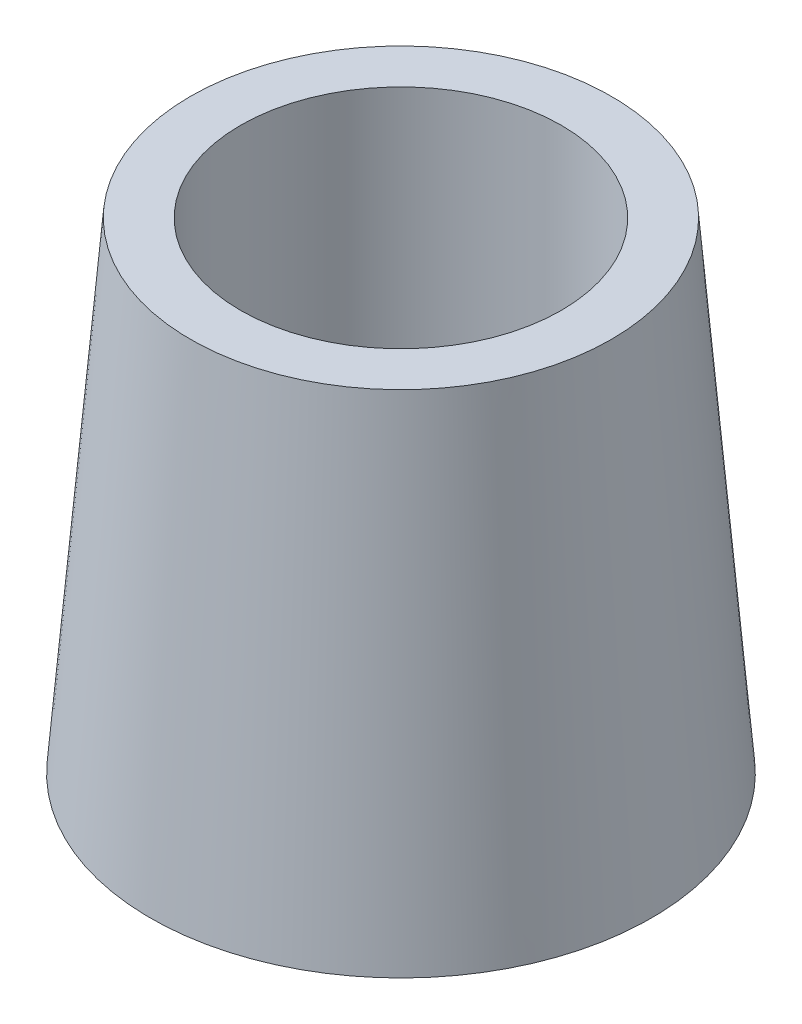
ISO-10303-21;
HEADER;
FILE_DESCRIPTION(('STEP AP214'),'2;1');
FILE_NAME('part.step','',(''),(''),'','','');
FILE_SCHEMA(('AUTOMOTIVE_DESIGN { 1 0 10303 214 1 1 1 1 }'));
ENDSEC;
DATA;
#1=APPLICATION_CONTEXT('core data for automotive mechanical design processes');
#2=APPLICATION_PROTOCOL_DEFINITION('international standard','automotive_design',2000,#1);
#3=PRODUCT_CONTEXT('',#1,'mechanical');
#4=PRODUCT('Part','Part','',(#3));
#5=PRODUCT_RELATED_PRODUCT_CATEGORY('part','',(#4));
#6=PRODUCT_DEFINITION_FORMATION('','',#4);
#7=PRODUCT_DEFINITION_CONTEXT('part definition',#1,'design');
#8=PRODUCT_DEFINITION('design','',#6,#7);
#9=PRODUCT_DEFINITION_SHAPE('','',#8);
#10=(LENGTH_UNIT() NAMED_UNIT(*) SI_UNIT(.MILLI.,.METRE.));
#11=(NAMED_UNIT(*) PLANE_ANGLE_UNIT() SI_UNIT($,.RADIAN.));
#12=(NAMED_UNIT(*) SI_UNIT($,.STERADIAN.) SOLID_ANGLE_UNIT());
#13=UNCERTAINTY_MEASURE_WITH_UNIT(LENGTH_MEASURE(1.E-05),#10,'distance_accuracy_value','');
#14=(GEOMETRIC_REPRESENTATION_CONTEXT(3) GLOBAL_UNCERTAINTY_ASSIGNED_CONTEXT((#13)) GLOBAL_UNIT_ASSIGNED_CONTEXT((#10,
#11,#12)) REPRESENTATION_CONTEXT('',''));
#15=CARTESIAN_POINT('',(0.,0.,0.));
#16=DIRECTION('',(0.,0.,1.));
#17=DIRECTION('',(1.,0.,0.));
#18=AXIS2_PLACEMENT_3D('',#15,#16,#17);
#19=CARTESIAN_POINT('',(0.,0.,0.));
#20=DIRECTION('',(0.,-1.,0.));
#21=DIRECTION('',(1.,0.,0.));
#22=AXIS2_PLACEMENT_3D('',#19,#20,#21);
#23=PLANE('',#22);
#24=CARTESIAN_POINT('',(0.,0.,0.));
#25=DIRECTION('',(0.,1.,0.));
#26=DIRECTION('',(-1.,0.,0.));
#27=AXIS2_PLACEMENT_3D('',#24,#25,#26);
#28=CIRCLE('',#27,8.);
#29=CARTESIAN_POINT('',(-8.,0.,0.));
#30=VERTEX_POINT('',#29);
#31=EDGE_CURVE('E54',#30,#30,#28,.T.);
#32=ORIENTED_EDGE('',*,*,#31,.T.);
#33=EDGE_LOOP('',(#32));
#34=FACE_BOUND('',#33,.T.);
#35=CARTESIAN_POINT('',(0.,0.,0.));
#36=DIRECTION('',(0.,1.,0.));
#37=DIRECTION('',(-1.,0.,0.));
#38=AXIS2_PLACEMENT_3D('',#35,#36,#37);
#39=CIRCLE('',#38,12.5);
#40=CARTESIAN_POINT('',(-12.5,0.,0.));
#41=VERTEX_POINT('',#40);
#42=EDGE_CURVE('E10',#41,#41,#39,.T.);
#43=ORIENTED_EDGE('',*,*,#42,.F.);
#44=EDGE_LOOP('',(#43));
#45=FACE_BOUND('',#44,.T.);
#46=ADVANCED_FACE('F38',(#34,#45),#23,.T.);
#47=CARTESIAN_POINT('',(0.,24.,0.));
#48=DIRECTION('',(0.,-1.,0.));
#49=DIRECTION('',(1.,0.,0.));
#50=AXIS2_PLACEMENT_3D('',#47,#48,#49);
#51=CONICAL_SURFACE('',#50,10.5,0.0831412318884413);
#52=ORIENTED_EDGE('',*,*,#42,.T.);
#53=EDGE_LOOP('',(#52));
#54=FACE_BOUND('',#53,.T.);
#55=CARTESIAN_POINT('',(0.,24.,0.));
#56=DIRECTION('',(0.,1.,0.));
#57=DIRECTION('',(-1.,0.,0.));
#58=AXIS2_PLACEMENT_3D('',#55,#56,#57);
#59=CIRCLE('',#58,10.5);
#60=CARTESIAN_POINT('',(-10.5,24.,0.));
#61=VERTEX_POINT('',#60);
#62=EDGE_CURVE('E46',#61,#61,#59,.T.);
#63=ORIENTED_EDGE('',*,*,#62,.F.);
#64=EDGE_LOOP('',(#63));
#65=FACE_BOUND('',#64,.T.);
#66=ADVANCED_FACE('F71',(#54,#65),#51,.T.);
#67=CARTESIAN_POINT('',(-10.5,24.,0.));
#68=DIRECTION('',(0.,1.,0.));
#69=DIRECTION('',(-1.,0.,0.));
#70=AXIS2_PLACEMENT_3D('',#67,#68,#69);
#71=PLANE('',#70);
#72=CARTESIAN_POINT('',(0.,24.,0.));
#73=DIRECTION('',(0.,1.,0.));
#74=DIRECTION('',(-1.,0.,0.));
#75=AXIS2_PLACEMENT_3D('',#72,#73,#74);
#76=CIRCLE('',#75,8.);
#77=CARTESIAN_POINT('',(-8.,24.,0.));
#78=VERTEX_POINT('',#77);
#79=EDGE_CURVE('E41',#78,#78,#76,.T.);
#80=ORIENTED_EDGE('',*,*,#79,.F.);
#81=EDGE_LOOP('',(#80));
#82=FACE_BOUND('',#81,.T.);
#83=ORIENTED_EDGE('',*,*,#62,.T.);
#84=EDGE_LOOP('',(#83));
#85=FACE_BOUND('',#84,.T.);
#86=ADVANCED_FACE('F68',(#82,#85),#71,.T.);
#87=CARTESIAN_POINT('',(0.,0.,0.));
#88=DIRECTION('',(0.,1.,0.));
#89=DIRECTION('',(-1.,0.,0.));
#90=AXIS2_PLACEMENT_3D('',#87,#88,#89);
#91=CYLINDRICAL_SURFACE('',#90,8.);
#92=ORIENTED_EDGE('',*,*,#79,.T.);
#93=EDGE_LOOP('',(#92));
#94=FACE_BOUND('',#93,.T.);
#95=ORIENTED_EDGE('',*,*,#31,.F.);
#96=EDGE_LOOP('',(#95));
#97=FACE_BOUND('',#96,.T.);
#98=ADVANCED_FACE('F65',(#94,#97),#91,.F.);
#99=CLOSED_SHELL('',(#46,#66,#86,#98));
#100=MANIFOLD_SOLID_BREP('B2',#99);
#101=ADVANCED_BREP_SHAPE_REPRESENTATION('',(#18,#100),#14);
#102=SHAPE_DEFINITION_REPRESENTATION(#9,#101);
ENDSEC;
END-ISO-10303-21;
